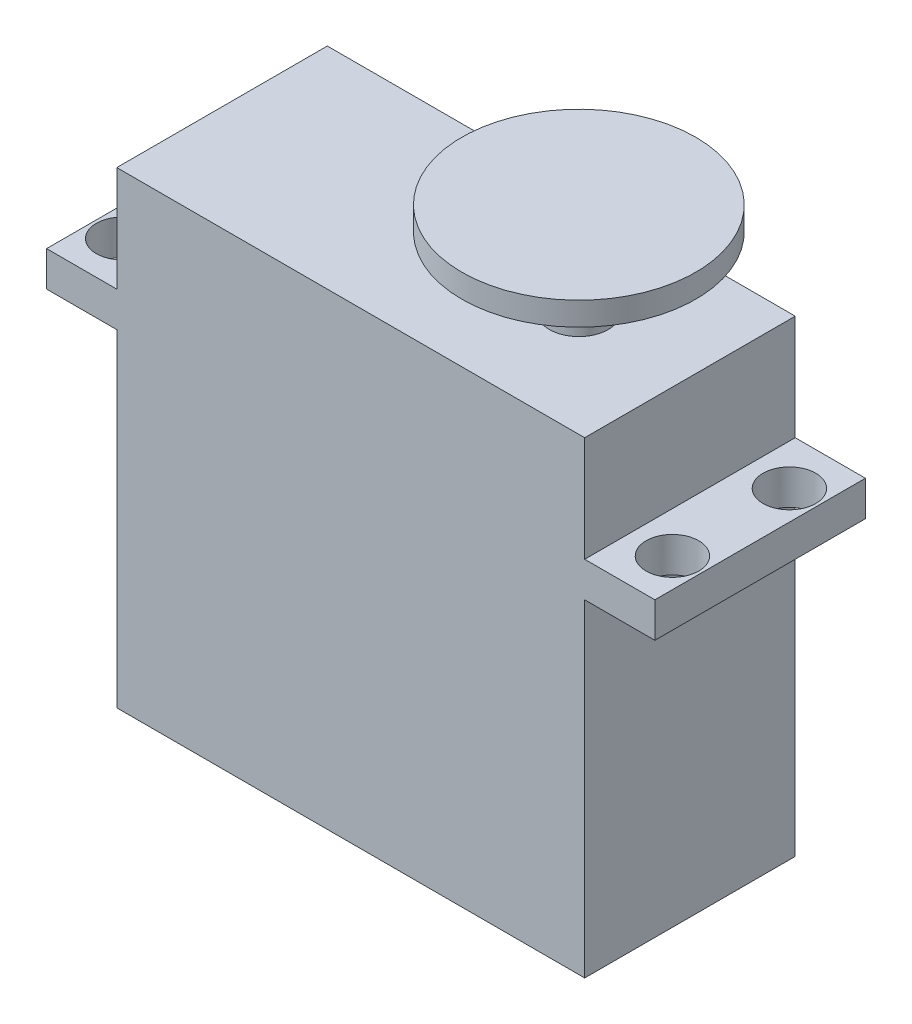
ISO-10303-21;
HEADER;
FILE_DESCRIPTION(('STEP AP214'),'2;1');
FILE_NAME('part.step','',(''),(''),'','','');
FILE_SCHEMA(('AUTOMOTIVE_DESIGN { 1 0 10303 214 1 1 1 1 }'));
ENDSEC;
DATA;
#1=APPLICATION_CONTEXT('core data for automotive mechanical design processes');
#2=APPLICATION_PROTOCOL_DEFINITION('international standard','automotive_design',2000,#1);
#3=PRODUCT_CONTEXT('',#1,'mechanical');
#4=PRODUCT('Part','Part','',(#3));
#5=PRODUCT_RELATED_PRODUCT_CATEGORY('part','',(#4));
#6=PRODUCT_DEFINITION_FORMATION('','',#4);
#7=PRODUCT_DEFINITION_CONTEXT('part definition',#1,'design');
#8=PRODUCT_DEFINITION('design','',#6,#7);
#9=PRODUCT_DEFINITION_SHAPE('','',#8);
#10=(LENGTH_UNIT() NAMED_UNIT(*) SI_UNIT(.MILLI.,.METRE.));
#11=(NAMED_UNIT(*) PLANE_ANGLE_UNIT() SI_UNIT($,.RADIAN.));
#12=(NAMED_UNIT(*) SI_UNIT($,.STERADIAN.) SOLID_ANGLE_UNIT());
#13=UNCERTAINTY_MEASURE_WITH_UNIT(LENGTH_MEASURE(1.E-05),#10,'distance_accuracy_value','');
#14=(GEOMETRIC_REPRESENTATION_CONTEXT(3) GLOBAL_UNCERTAINTY_ASSIGNED_CONTEXT((#13)) GLOBAL_UNIT_ASSIGNED_CONTEXT((#10,
#11,#12)) REPRESENTATION_CONTEXT('',''));
#15=CARTESIAN_POINT('',(0.,0.,0.));
#16=DIRECTION('',(0.,0.,1.));
#17=DIRECTION('',(1.,0.,0.));
#18=AXIS2_PLACEMENT_3D('',#15,#16,#17);
#19=CARTESIAN_POINT('',(40.,40.,0.));
#20=DIRECTION('',(-1.,0.,0.));
#21=DIRECTION('',(0.,0.,1.));
#22=AXIS2_PLACEMENT_3D('',#19,#20,#21);
#23=PLANE('',#22);
#24=DIRECTION('',(0.,0.,-1.));
#25=VECTOR('',#24,1.);
#26=CARTESIAN_POINT('',(40.,28.,0.));
#27=LINE('',#26,#25);
#28=CARTESIAN_POINT('',(40.,28.,0.));
#29=VERTEX_POINT('',#28);
#30=CARTESIAN_POINT('',(40.,28.,-18.));
#31=VERTEX_POINT('',#30);
#32=EDGE_CURVE('E148',#29,#31,#27,.T.);
#33=ORIENTED_EDGE('',*,*,#32,.F.);
#34=DIRECTION('',(0.,-1.,0.));
#35=VECTOR('',#34,1.);
#36=CARTESIAN_POINT('',(40.,40.,0.));
#37=LINE('',#36,#35);
#38=CARTESIAN_POINT('',(40.,0.,0.));
#39=VERTEX_POINT('',#38);
#40=EDGE_CURVE('E211',#29,#39,#37,.T.);
#41=ORIENTED_EDGE('',*,*,#40,.T.);
#42=DIRECTION('',(0.,0.,-1.));
#43=VECTOR('',#42,1.);
#44=CARTESIAN_POINT('',(40.,0.,0.));
#45=LINE('',#44,#43);
#46=CARTESIAN_POINT('',(40.,0.,-18.));
#47=VERTEX_POINT('',#46);
#48=EDGE_CURVE('E199',#39,#47,#45,.T.);
#49=ORIENTED_EDGE('',*,*,#48,.T.);
#50=DIRECTION('',(0.,-1.,0.));
#51=VECTOR('',#50,1.);
#52=CARTESIAN_POINT('',(40.,40.,-18.));
#53=LINE('',#52,#51);
#54=EDGE_CURVE('E207',#31,#47,#53,.T.);
#55=ORIENTED_EDGE('',*,*,#54,.F.);
#56=EDGE_LOOP('',(#33,#41,#49,#55));
#57=FACE_BOUND('',#56,.T.);
#58=ADVANCED_FACE('F34',(#57),#23,.F.);
#59=CARTESIAN_POINT('',(0.,40.,0.));
#60=DIRECTION('',(1.,0.,0.));
#61=DIRECTION('',(0.,0.,-1.));
#62=AXIS2_PLACEMENT_3D('',#59,#60,#61);
#63=PLANE('',#62);
#64=DIRECTION('',(0.,0.,1.));
#65=VECTOR('',#64,1.);
#66=CARTESIAN_POINT('',(0.,28.,0.));
#67=LINE('',#66,#65);
#68=CARTESIAN_POINT('',(0.,28.,-18.));
#69=VERTEX_POINT('',#68);
#70=CARTESIAN_POINT('',(0.,28.,0.));
#71=VERTEX_POINT('',#70);
#72=EDGE_CURVE('E175',#69,#71,#67,.T.);
#73=ORIENTED_EDGE('',*,*,#72,.F.);
#74=DIRECTION('',(0.,-1.,0.));
#75=VECTOR('',#74,1.);
#76=CARTESIAN_POINT('',(0.,40.,-18.));
#77=LINE('',#76,#75);
#78=CARTESIAN_POINT('',(0.,0.,-18.));
#79=VERTEX_POINT('',#78);
#80=EDGE_CURVE('E194',#69,#79,#77,.T.);
#81=ORIENTED_EDGE('',*,*,#80,.T.);
#82=DIRECTION('',(0.,0.,1.));
#83=VECTOR('',#82,1.);
#84=CARTESIAN_POINT('',(0.,0.,0.));
#85=LINE('',#84,#83);
#86=CARTESIAN_POINT('',(0.,0.,0.));
#87=VERTEX_POINT('',#86);
#88=EDGE_CURVE('E181',#79,#87,#85,.T.);
#89=ORIENTED_EDGE('',*,*,#88,.T.);
#90=DIRECTION('',(0.,-1.,0.));
#91=VECTOR('',#90,1.);
#92=CARTESIAN_POINT('',(0.,40.,0.));
#93=LINE('',#92,#91);
#94=EDGE_CURVE('E213',#71,#87,#93,.T.);
#95=ORIENTED_EDGE('',*,*,#94,.F.);
#96=EDGE_LOOP('',(#73,#81,#89,#95));
#97=FACE_BOUND('',#96,.T.);
#98=ADVANCED_FACE('F226',(#97),#63,.F.);
#99=CARTESIAN_POINT('',(0.,40.,-18.));
#100=VERTEX_POINT('',#99);
#101=CARTESIAN_POINT('',(0.,31.,-18.));
#102=VERTEX_POINT('',#101);
#103=EDGE_CURVE('E204',#100,#102,#77,.T.);
#104=ORIENTED_EDGE('',*,*,#103,.T.);
#105=DIRECTION('',(0.,0.,1.));
#106=VECTOR('',#105,1.);
#107=CARTESIAN_POINT('',(0.,31.,0.));
#108=LINE('',#107,#106);
#109=CARTESIAN_POINT('',(0.,31.,0.));
#110=VERTEX_POINT('',#109);
#111=EDGE_CURVE('E167',#102,#110,#108,.T.);
#112=ORIENTED_EDGE('',*,*,#111,.T.);
#113=CARTESIAN_POINT('',(0.,40.,0.));
#114=VERTEX_POINT('',#113);
#115=EDGE_CURVE('E42',#114,#110,#93,.T.);
#116=ORIENTED_EDGE('',*,*,#115,.F.);
#117=DIRECTION('',(0.,0.,1.));
#118=VECTOR('',#117,1.);
#119=CARTESIAN_POINT('',(0.,40.,0.));
#120=LINE('',#119,#118);
#121=EDGE_CURVE('E184',#100,#114,#120,.T.);
#122=ORIENTED_EDGE('',*,*,#121,.F.);
#123=EDGE_LOOP('',(#104,#112,#116,#122));
#124=FACE_BOUND('',#123,.T.);
#125=ADVANCED_FACE('F36',(#124),#63,.F.);
#126=CARTESIAN_POINT('',(0.,40.,0.));
#127=DIRECTION('',(0.,0.,-1.));
#128=DIRECTION('',(-1.,0.,0.));
#129=AXIS2_PLACEMENT_3D('',#126,#127,#128);
#130=PLANE('',#129);
#131=DIRECTION('',(1.,0.,0.));
#132=VECTOR('',#131,1.);
#133=CARTESIAN_POINT('',(0.,0.,0.));
#134=LINE('',#133,#132);
#135=EDGE_CURVE('E197',#87,#39,#134,.T.);
#136=ORIENTED_EDGE('',*,*,#135,.T.);
#137=ORIENTED_EDGE('',*,*,#40,.F.);
#138=DIRECTION('',(1.,0.,0.));
#139=VECTOR('',#138,1.);
#140=CARTESIAN_POINT('',(0.,28.,0.));
#141=LINE('',#140,#139);
#142=CARTESIAN_POINT('',(46.,28.,0.));
#143=VERTEX_POINT('',#142);
#144=EDGE_CURVE('E138',#29,#143,#141,.T.);
#145=ORIENTED_EDGE('',*,*,#144,.T.);
#146=DIRECTION('',(0.,-1.,0.));
#147=VECTOR('',#146,1.);
#148=CARTESIAN_POINT('',(46.,31.,0.));
#149=LINE('',#148,#147);
#150=CARTESIAN_POINT('',(46.,31.,0.));
#151=VERTEX_POINT('',#150);
#152=EDGE_CURVE('E134',#151,#143,#149,.T.);
#153=ORIENTED_EDGE('',*,*,#152,.F.);
#154=DIRECTION('',(1.,0.,0.));
#155=VECTOR('',#154,1.);
#156=CARTESIAN_POINT('',(0.,31.,0.));
#157=LINE('',#156,#155);
#158=CARTESIAN_POINT('',(40.,31.,0.));
#159=VERTEX_POINT('',#158);
#160=EDGE_CURVE('E122',#159,#151,#157,.T.);
#161=ORIENTED_EDGE('',*,*,#160,.F.);
#162=CARTESIAN_POINT('',(40.,40.,0.));
#163=VERTEX_POINT('',#162);
#164=EDGE_CURVE('E212',#163,#159,#37,.T.);
#165=ORIENTED_EDGE('',*,*,#164,.F.);
#166=DIRECTION('',(1.,0.,0.));
#167=VECTOR('',#166,1.);
#168=CARTESIAN_POINT('',(0.,40.,0.));
#169=LINE('',#168,#167);
#170=EDGE_CURVE('E187',#114,#163,#169,.T.);
#171=ORIENTED_EDGE('',*,*,#170,.F.);
#172=ORIENTED_EDGE('',*,*,#115,.T.);
#173=DIRECTION('',(-1.,0.,0.));
#174=VECTOR('',#173,1.);
#175=CARTESIAN_POINT('',(0.,31.,0.));
#176=LINE('',#175,#174);
#177=CARTESIAN_POINT('',(-6.,31.,0.));
#178=VERTEX_POINT('',#177);
#179=EDGE_CURVE('E57',#110,#178,#176,.T.);
#180=ORIENTED_EDGE('',*,*,#179,.T.);
#181=DIRECTION('',(0.,-1.,0.));
#182=VECTOR('',#181,1.);
#183=CARTESIAN_POINT('',(-6.,31.,0.));
#184=LINE('',#183,#182);
#185=CARTESIAN_POINT('',(-6.,28.,0.));
#186=VERTEX_POINT('',#185);
#187=EDGE_CURVE('E179',#178,#186,#184,.T.);
#188=ORIENTED_EDGE('',*,*,#187,.T.);
#189=DIRECTION('',(-1.,0.,0.));
#190=VECTOR('',#189,1.);
#191=CARTESIAN_POINT('',(0.,28.,0.));
#192=LINE('',#191,#190);
#193=EDGE_CURVE('E165',#71,#186,#192,.T.);
#194=ORIENTED_EDGE('',*,*,#193,.F.);
#195=ORIENTED_EDGE('',*,*,#94,.T.);
#196=EDGE_LOOP('',(#136,#137,#145,#153,#161,#165,#171,#172,#180,#188,#194,#195));
#197=FACE_BOUND('',#196,.T.);
#198=ADVANCED_FACE('F136',(#197),#130,.F.);
#199=ORIENTED_EDGE('',*,*,#164,.T.);
#200=DIRECTION('',(0.,0.,-1.));
#201=VECTOR('',#200,1.);
#202=CARTESIAN_POINT('',(40.,31.,0.));
#203=LINE('',#202,#201);
#204=CARTESIAN_POINT('',(40.,31.,-18.));
#205=VERTEX_POINT('',#204);
#206=EDGE_CURVE('E128',#159,#205,#203,.T.);
#207=ORIENTED_EDGE('',*,*,#206,.T.);
#208=CARTESIAN_POINT('',(40.,40.,-18.));
#209=VERTEX_POINT('',#208);
#210=EDGE_CURVE('E208',#209,#205,#53,.T.);
#211=ORIENTED_EDGE('',*,*,#210,.F.);
#212=DIRECTION('',(0.,0.,-1.));
#213=VECTOR('',#212,1.);
#214=CARTESIAN_POINT('',(40.,40.,0.));
#215=LINE('',#214,#213);
#216=EDGE_CURVE('E190',#163,#209,#215,.T.);
#217=ORIENTED_EDGE('',*,*,#216,.F.);
#218=EDGE_LOOP('',(#199,#207,#211,#217));
#219=FACE_BOUND('',#218,.T.);
#220=ADVANCED_FACE('F254',(#219),#23,.F.);
#221=CARTESIAN_POINT('',(0.,40.,-18.));
#222=DIRECTION('',(0.,0.,1.));
#223=DIRECTION('',(1.,0.,0.));
#224=AXIS2_PLACEMENT_3D('',#221,#222,#223);
#225=PLANE('',#224);
#226=DIRECTION('',(-1.,0.,0.));
#227=VECTOR('',#226,1.);
#228=CARTESIAN_POINT('',(0.,0.,-18.));
#229=LINE('',#228,#227);
#230=EDGE_CURVE('E188',#47,#79,#229,.T.);
#231=ORIENTED_EDGE('',*,*,#230,.T.);
#232=ORIENTED_EDGE('',*,*,#80,.F.);
#233=DIRECTION('',(-1.,0.,0.));
#234=VECTOR('',#233,1.);
#235=CARTESIAN_POINT('',(0.,28.,-18.));
#236=LINE('',#235,#234);
#237=CARTESIAN_POINT('',(-6.,28.,-18.));
#238=VERTEX_POINT('',#237);
#239=EDGE_CURVE('E173',#69,#238,#236,.T.);
#240=ORIENTED_EDGE('',*,*,#239,.T.);
#241=DIRECTION('',(0.,-1.,0.));
#242=VECTOR('',#241,1.);
#243=CARTESIAN_POINT('',(-6.,31.,-18.));
#244=LINE('',#243,#242);
#245=CARTESIAN_POINT('',(-6.,31.,-18.));
#246=VERTEX_POINT('',#245);
#247=EDGE_CURVE('E170',#246,#238,#244,.T.);
#248=ORIENTED_EDGE('',*,*,#247,.F.);
#249=DIRECTION('',(-1.,0.,0.));
#250=VECTOR('',#249,1.);
#251=CARTESIAN_POINT('',(0.,31.,-18.));
#252=LINE('',#251,#250);
#253=EDGE_CURVE('E164',#102,#246,#252,.T.);
#254=ORIENTED_EDGE('',*,*,#253,.F.);
#255=ORIENTED_EDGE('',*,*,#103,.F.);
#256=DIRECTION('',(-1.,0.,0.));
#257=VECTOR('',#256,1.);
#258=CARTESIAN_POINT('',(0.,40.,-18.));
#259=LINE('',#258,#257);
#260=EDGE_CURVE('E192',#209,#100,#259,.T.);
#261=ORIENTED_EDGE('',*,*,#260,.F.);
#262=ORIENTED_EDGE('',*,*,#210,.T.);
#263=DIRECTION('',(1.,0.,0.));
#264=VECTOR('',#263,1.);
#265=CARTESIAN_POINT('',(0.,31.,-18.));
#266=LINE('',#265,#264);
#267=CARTESIAN_POINT('',(46.,31.,-18.));
#268=VERTEX_POINT('',#267);
#269=EDGE_CURVE('E49',#205,#268,#266,.T.);
#270=ORIENTED_EDGE('',*,*,#269,.T.);
#271=DIRECTION('',(0.,-1.,0.));
#272=VECTOR('',#271,1.);
#273=CARTESIAN_POINT('',(46.,31.,-18.));
#274=LINE('',#273,#272);
#275=CARTESIAN_POINT('',(46.,28.,-18.));
#276=VERTEX_POINT('',#275);
#277=EDGE_CURVE('E142',#268,#276,#274,.T.);
#278=ORIENTED_EDGE('',*,*,#277,.T.);
#279=DIRECTION('',(1.,0.,0.));
#280=VECTOR('',#279,1.);
#281=CARTESIAN_POINT('',(0.,28.,-18.));
#282=LINE('',#281,#280);
#283=EDGE_CURVE('E145',#31,#276,#282,.T.);
#284=ORIENTED_EDGE('',*,*,#283,.F.);
#285=ORIENTED_EDGE('',*,*,#54,.T.);
#286=EDGE_LOOP('',(#231,#232,#240,#248,#254,#255,#261,#262,#270,#278,#284,#285));
#287=FACE_BOUND('',#286,.T.);
#288=ADVANCED_FACE('F229',(#287),#225,.F.);
#289=CARTESIAN_POINT('',(0.,40.,0.));
#290=DIRECTION('',(0.,-1.,0.));
#291=DIRECTION('',(0.,0.,-1.));
#292=AXIS2_PLACEMENT_3D('',#289,#290,#291);
#293=PLANE('',#292);
#294=CARTESIAN_POINT('',(30.5,40.,-9.));
#295=DIRECTION('',(0.,-1.,0.));
#296=DIRECTION('',(0.,0.,-1.));
#297=AXIS2_PLACEMENT_3D('',#294,#295,#296);
#298=CIRCLE('',#297,2.5);
#299=CARTESIAN_POINT('',(30.5,40.,-11.5));
#300=VERTEX_POINT('',#299);
#301=EDGE_CURVE('E11',#300,#300,#298,.F.);
#302=ORIENTED_EDGE('',*,*,#301,.F.);
#303=EDGE_LOOP('',(#302));
#304=FACE_BOUND('',#303,.T.);
#305=ORIENTED_EDGE('',*,*,#121,.T.);
#306=ORIENTED_EDGE('',*,*,#170,.T.);
#307=ORIENTED_EDGE('',*,*,#216,.T.);
#308=ORIENTED_EDGE('',*,*,#260,.T.);
#309=EDGE_LOOP('',(#305,#306,#307,#308));
#310=FACE_BOUND('',#309,.T.);
#311=ADVANCED_FACE('F265',(#304,#310),#293,.F.);
#312=CARTESIAN_POINT('',(0.,0.,0.));
#313=DIRECTION('',(0.,-1.,0.));
#314=DIRECTION('',(0.,0.,-1.));
#315=AXIS2_PLACEMENT_3D('',#312,#313,#314);
#316=PLANE('',#315);
#317=ORIENTED_EDGE('',*,*,#88,.F.);
#318=ORIENTED_EDGE('',*,*,#230,.F.);
#319=ORIENTED_EDGE('',*,*,#48,.F.);
#320=ORIENTED_EDGE('',*,*,#135,.F.);
#321=EDGE_LOOP('',(#317,#318,#319,#320));
#322=FACE_BOUND('',#321,.T.);
#323=ADVANCED_FACE('F224',(#322),#316,.T.);
#324=CARTESIAN_POINT('',(-6.,31.,0.));
#325=DIRECTION('',(1.,0.,0.));
#326=DIRECTION('',(0.,0.,-1.));
#327=AXIS2_PLACEMENT_3D('',#324,#325,#326);
#328=PLANE('',#327);
#329=DIRECTION('',(0.,0.,1.));
#330=VECTOR('',#329,1.);
#331=CARTESIAN_POINT('',(-6.,28.,0.));
#332=LINE('',#331,#330);
#333=EDGE_CURVE('E160',#238,#186,#332,.T.);
#334=ORIENTED_EDGE('',*,*,#333,.T.);
#335=ORIENTED_EDGE('',*,*,#187,.F.);
#336=DIRECTION('',(0.,0.,1.));
#337=VECTOR('',#336,1.);
#338=CARTESIAN_POINT('',(-6.,31.,0.));
#339=LINE('',#338,#337);
#340=EDGE_CURVE('E162',#246,#178,#339,.T.);
#341=ORIENTED_EDGE('',*,*,#340,.F.);
#342=ORIENTED_EDGE('',*,*,#247,.T.);
#343=EDGE_LOOP('',(#334,#335,#341,#342));
#344=FACE_BOUND('',#343,.T.);
#345=ADVANCED_FACE('F279',(#344),#328,.F.);
#346=CARTESIAN_POINT('',(0.,31.,0.));
#347=DIRECTION('',(0.,-1.,0.));
#348=DIRECTION('',(0.,0.,-1.));
#349=AXIS2_PLACEMENT_3D('',#346,#347,#348);
#350=PLANE('',#349);
#351=CARTESIAN_POINT('',(-3.5,31.,-14.));
#352=DIRECTION('',(0.,1.,0.));
#353=DIRECTION('',(0.,0.,1.));
#354=AXIS2_PLACEMENT_3D('',#351,#352,#353);
#355=CIRCLE('',#354,2.25);
#356=CARTESIAN_POINT('',(-3.5,31.,-11.75));
#357=VERTEX_POINT('',#356);
#358=EDGE_CURVE('E401',#357,#357,#355,.T.);
#359=ORIENTED_EDGE('',*,*,#358,.F.);
#360=EDGE_LOOP('',(#359));
#361=FACE_BOUND('',#360,.T.);
#362=CARTESIAN_POINT('',(-3.5,31.,-4.));
#363=DIRECTION('',(0.,1.,0.));
#364=DIRECTION('',(0.,0.,1.));
#365=AXIS2_PLACEMENT_3D('',#362,#363,#364);
#366=CIRCLE('',#365,2.25);
#367=CARTESIAN_POINT('',(-3.5,31.,-1.75));
#368=VERTEX_POINT('',#367);
#369=EDGE_CURVE('E410',#368,#368,#366,.T.);
#370=ORIENTED_EDGE('',*,*,#369,.F.);
#371=EDGE_LOOP('',(#370));
#372=FACE_BOUND('',#371,.T.);
#373=ORIENTED_EDGE('',*,*,#340,.T.);
#374=ORIENTED_EDGE('',*,*,#179,.F.);
#375=ORIENTED_EDGE('',*,*,#111,.F.);
#376=ORIENTED_EDGE('',*,*,#253,.T.);
#377=EDGE_LOOP('',(#373,#374,#375,#376));
#378=FACE_BOUND('',#377,.T.);
#379=ADVANCED_FACE('F273',(#361,#372,#378),#350,.F.);
#380=CARTESIAN_POINT('',(0.,28.,0.));
#381=DIRECTION('',(0.,-1.,0.));
#382=DIRECTION('',(0.,0.,-1.));
#383=AXIS2_PLACEMENT_3D('',#380,#381,#382);
#384=PLANE('',#383);
#385=CARTESIAN_POINT('',(-3.5,28.,-14.));
#386=DIRECTION('',(0.,-1.,0.));
#387=DIRECTION('',(0.,0.,-1.));
#388=AXIS2_PLACEMENT_3D('',#385,#386,#387);
#389=CIRCLE('',#388,2.25);
#390=CARTESIAN_POINT('',(-3.5,28.,-16.25));
#391=VERTEX_POINT('',#390);
#392=EDGE_CURVE('E404',#391,#391,#389,.F.);
#393=ORIENTED_EDGE('',*,*,#392,.T.);
#394=EDGE_LOOP('',(#393));
#395=FACE_BOUND('',#394,.T.);
#396=CARTESIAN_POINT('',(-3.5,28.,-4.));
#397=DIRECTION('',(0.,-1.,0.));
#398=DIRECTION('',(0.,0.,-1.));
#399=AXIS2_PLACEMENT_3D('',#396,#397,#398);
#400=CIRCLE('',#399,2.25);
#401=CARTESIAN_POINT('',(-3.5,28.,-6.25));
#402=VERTEX_POINT('',#401);
#403=EDGE_CURVE('E407',#402,#402,#400,.F.);
#404=ORIENTED_EDGE('',*,*,#403,.T.);
#405=EDGE_LOOP('',(#404));
#406=FACE_BOUND('',#405,.T.);
#407=ORIENTED_EDGE('',*,*,#333,.F.);
#408=ORIENTED_EDGE('',*,*,#239,.F.);
#409=ORIENTED_EDGE('',*,*,#72,.T.);
#410=ORIENTED_EDGE('',*,*,#193,.T.);
#411=EDGE_LOOP('',(#407,#408,#409,#410));
#412=FACE_BOUND('',#411,.T.);
#413=ADVANCED_FACE('F281',(#395,#406,#412),#384,.T.);
#414=CARTESIAN_POINT('',(46.,31.,0.));
#415=DIRECTION('',(-1.,0.,0.));
#416=DIRECTION('',(0.,0.,1.));
#417=AXIS2_PLACEMENT_3D('',#414,#415,#416);
#418=PLANE('',#417);
#419=DIRECTION('',(0.,0.,-1.));
#420=VECTOR('',#419,1.);
#421=CARTESIAN_POINT('',(46.,28.,0.));
#422=LINE('',#421,#420);
#423=EDGE_CURVE('E156',#143,#276,#422,.T.);
#424=ORIENTED_EDGE('',*,*,#423,.T.);
#425=ORIENTED_EDGE('',*,*,#277,.F.);
#426=DIRECTION('',(0.,0.,-1.));
#427=VECTOR('',#426,1.);
#428=CARTESIAN_POINT('',(46.,31.,0.));
#429=LINE('',#428,#427);
#430=EDGE_CURVE('E126',#151,#268,#429,.T.);
#431=ORIENTED_EDGE('',*,*,#430,.F.);
#432=ORIENTED_EDGE('',*,*,#152,.T.);
#433=EDGE_LOOP('',(#424,#425,#431,#432));
#434=FACE_BOUND('',#433,.T.);
#435=ADVANCED_FACE('F144',(#434),#418,.F.);
#436=CARTESIAN_POINT('',(0.,31.,0.));
#437=DIRECTION('',(0.,-1.,0.));
#438=DIRECTION('',(0.,0.,-1.));
#439=AXIS2_PLACEMENT_3D('',#436,#437,#438);
#440=PLANE('',#439);
#441=CARTESIAN_POINT('',(43.5,31.,-14.));
#442=DIRECTION('',(0.,-1.,0.));
#443=DIRECTION('',(0.,0.,1.));
#444=AXIS2_PLACEMENT_3D('',#441,#442,#443);
#445=CIRCLE('',#444,2.25);
#446=CARTESIAN_POINT('',(43.5,31.,-11.75));
#447=VERTEX_POINT('',#446);
#448=EDGE_CURVE('E418',#447,#447,#445,.T.);
#449=ORIENTED_EDGE('',*,*,#448,.T.);
#450=EDGE_LOOP('',(#449));
#451=FACE_BOUND('',#450,.T.);
#452=CARTESIAN_POINT('',(43.5,31.,-4.));
#453=DIRECTION('',(0.,-1.,0.));
#454=DIRECTION('',(0.,0.,1.));
#455=AXIS2_PLACEMENT_3D('',#452,#453,#454);
#456=CIRCLE('',#455,2.25);
#457=CARTESIAN_POINT('',(43.5,31.,-1.75));
#458=VERTEX_POINT('',#457);
#459=EDGE_CURVE('E419',#458,#458,#456,.T.);
#460=ORIENTED_EDGE('',*,*,#459,.T.);
#461=EDGE_LOOP('',(#460));
#462=FACE_BOUND('',#461,.T.);
#463=ORIENTED_EDGE('',*,*,#430,.T.);
#464=ORIENTED_EDGE('',*,*,#269,.F.);
#465=ORIENTED_EDGE('',*,*,#206,.F.);
#466=ORIENTED_EDGE('',*,*,#160,.T.);
#467=EDGE_LOOP('',(#463,#464,#465,#466));
#468=FACE_BOUND('',#467,.T.);
#469=ADVANCED_FACE('F124',(#451,#462,#468),#440,.F.);
#470=CARTESIAN_POINT('',(0.,28.,0.));
#471=DIRECTION('',(0.,-1.,0.));
#472=DIRECTION('',(0.,0.,-1.));
#473=AXIS2_PLACEMENT_3D('',#470,#471,#472);
#474=PLANE('',#473);
#475=CARTESIAN_POINT('',(43.5,28.,-14.));
#476=DIRECTION('',(0.,-1.,0.));
#477=DIRECTION('',(0.,0.,-1.));
#478=AXIS2_PLACEMENT_3D('',#475,#476,#477);
#479=CIRCLE('',#478,2.25);
#480=CARTESIAN_POINT('',(43.5,28.,-16.25));
#481=VERTEX_POINT('',#480);
#482=EDGE_CURVE('E411',#481,#481,#479,.T.);
#483=ORIENTED_EDGE('',*,*,#482,.F.);
#484=EDGE_LOOP('',(#483));
#485=FACE_BOUND('',#484,.T.);
#486=CARTESIAN_POINT('',(43.5,28.,-4.));
#487=DIRECTION('',(0.,-1.,0.));
#488=DIRECTION('',(0.,0.,-1.));
#489=AXIS2_PLACEMENT_3D('',#486,#487,#488);
#490=CIRCLE('',#489,2.25);
#491=CARTESIAN_POINT('',(43.5,28.,-6.25));
#492=VERTEX_POINT('',#491);
#493=EDGE_CURVE('E415',#492,#492,#490,.T.);
#494=ORIENTED_EDGE('',*,*,#493,.F.);
#495=EDGE_LOOP('',(#494));
#496=FACE_BOUND('',#495,.T.);
#497=ORIENTED_EDGE('',*,*,#423,.F.);
#498=ORIENTED_EDGE('',*,*,#144,.F.);
#499=ORIENTED_EDGE('',*,*,#32,.T.);
#500=ORIENTED_EDGE('',*,*,#283,.T.);
#501=EDGE_LOOP('',(#497,#498,#499,#500));
#502=FACE_BOUND('',#501,.T.);
#503=ADVANCED_FACE('F235',(#485,#496,#502),#474,.T.);
#504=CARTESIAN_POINT('',(30.5,46.,-9.));
#505=DIRECTION('',(0.,-1.,0.));
#506=DIRECTION('',(0.,0.,-1.));
#507=AXIS2_PLACEMENT_3D('',#504,#505,#506);
#508=CYLINDRICAL_SURFACE('',#507,2.5);
#509=CARTESIAN_POINT('',(30.5,46.,-9.));
#510=DIRECTION('',(0.,1.,0.));
#511=DIRECTION('',(0.,0.,1.));
#512=AXIS2_PLACEMENT_3D('',#509,#510,#511);
#513=CIRCLE('',#512,2.5);
#514=CARTESIAN_POINT('',(30.5,46.,-6.5));
#515=VERTEX_POINT('',#514);
#516=EDGE_CURVE('E151',#515,#515,#513,.T.);
#517=ORIENTED_EDGE('',*,*,#516,.F.);
#518=EDGE_LOOP('',(#517));
#519=FACE_BOUND('',#518,.T.);
#520=ORIENTED_EDGE('',*,*,#301,.T.);
#521=EDGE_LOOP('',(#520));
#522=FACE_BOUND('',#521,.T.);
#523=ADVANCED_FACE('F237',(#519,#522),#508,.T.);
#524=CARTESIAN_POINT('',(30.5,48.,-9.));
#525=DIRECTION('',(0.,-1.,0.));
#526=DIRECTION('',(0.,0.,-1.));
#527=AXIS2_PLACEMENT_3D('',#524,#525,#526);
#528=CYLINDRICAL_SURFACE('',#527,10.);
#529=CARTESIAN_POINT('',(30.5,48.,-9.));
#530=DIRECTION('',(0.,1.,0.));
#531=DIRECTION('',(0.,0.,1.));
#532=AXIS2_PLACEMENT_3D('',#529,#530,#531);
#533=CIRCLE('',#532,10.);
#534=CARTESIAN_POINT('',(30.5,48.,1.));
#535=VERTEX_POINT('',#534);
#536=EDGE_CURVE('E396',#535,#535,#533,.T.);
#537=ORIENTED_EDGE('',*,*,#536,.F.);
#538=EDGE_LOOP('',(#537));
#539=FACE_BOUND('',#538,.T.);
#540=CARTESIAN_POINT('',(30.5,46.,-9.));
#541=DIRECTION('',(0.,1.,0.));
#542=DIRECTION('',(0.,0.,1.));
#543=AXIS2_PLACEMENT_3D('',#540,#541,#542);
#544=CIRCLE('',#543,10.);
#545=CARTESIAN_POINT('',(30.5,46.,1.));
#546=VERTEX_POINT('',#545);
#547=EDGE_CURVE('E399',#546,#546,#544,.T.);
#548=ORIENTED_EDGE('',*,*,#547,.T.);
#549=EDGE_LOOP('',(#548));
#550=FACE_BOUND('',#549,.T.);
#551=ADVANCED_FACE('F244',(#539,#550),#528,.T.);
#552=CARTESIAN_POINT('',(30.5,48.,-9.));
#553=DIRECTION('',(0.,1.,0.));
#554=DIRECTION('',(0.,0.,1.));
#555=AXIS2_PLACEMENT_3D('',#552,#553,#554);
#556=PLANE('',#555);
#557=ORIENTED_EDGE('',*,*,#536,.T.);
#558=EDGE_LOOP('',(#557));
#559=FACE_BOUND('',#558,.T.);
#560=ADVANCED_FACE('F383',(#559),#556,.T.);
#561=CARTESIAN_POINT('',(30.5,46.,-9.));
#562=DIRECTION('',(0.,1.,0.));
#563=DIRECTION('',(0.,0.,1.));
#564=AXIS2_PLACEMENT_3D('',#561,#562,#563);
#565=PLANE('',#564);
#566=ORIENTED_EDGE('',*,*,#516,.T.);
#567=EDGE_LOOP('',(#566));
#568=FACE_BOUND('',#567,.T.);
#569=ORIENTED_EDGE('',*,*,#547,.F.);
#570=EDGE_LOOP('',(#569));
#571=FACE_BOUND('',#570,.T.);
#572=ADVANCED_FACE('F320',(#568,#571),#565,.F.);
#573=CARTESIAN_POINT('',(-3.5,-0.001000000000001,-4.));
#574=DIRECTION('',(0.,1.,0.));
#575=DIRECTION('',(0.,0.,1.));
#576=AXIS2_PLACEMENT_3D('',#573,#574,#575);
#577=CYLINDRICAL_SURFACE('',#576,2.25);
#578=ORIENTED_EDGE('',*,*,#403,.F.);
#579=EDGE_LOOP('',(#578));
#580=FACE_BOUND('',#579,.T.);
#581=ORIENTED_EDGE('',*,*,#369,.T.);
#582=EDGE_LOOP('',(#581));
#583=FACE_BOUND('',#582,.T.);
#584=ADVANCED_FACE('F330',(#580,#583),#577,.F.);
#585=CARTESIAN_POINT('',(-3.5,-0.001000000000001,-14.));
#586=DIRECTION('',(0.,1.,0.));
#587=DIRECTION('',(0.,0.,1.));
#588=AXIS2_PLACEMENT_3D('',#585,#586,#587);
#589=CYLINDRICAL_SURFACE('',#588,2.25);
#590=ORIENTED_EDGE('',*,*,#392,.F.);
#591=EDGE_LOOP('',(#590));
#592=FACE_BOUND('',#591,.T.);
#593=ORIENTED_EDGE('',*,*,#358,.T.);
#594=EDGE_LOOP('',(#593));
#595=FACE_BOUND('',#594,.T.);
#596=ADVANCED_FACE('F335',(#592,#595),#589,.F.);
#597=CARTESIAN_POINT('',(43.5,-0.001000000000001,-4.));
#598=DIRECTION('',(0.,1.,0.));
#599=DIRECTION('',(0.,0.,1.));
#600=AXIS2_PLACEMENT_3D('',#597,#598,#599);
#601=CYLINDRICAL_SURFACE('',#600,2.25);
#602=ORIENTED_EDGE('',*,*,#493,.T.);
#603=EDGE_LOOP('',(#602));
#604=FACE_BOUND('',#603,.T.);
#605=ORIENTED_EDGE('',*,*,#459,.F.);
#606=EDGE_LOOP('',(#605));
#607=FACE_BOUND('',#606,.T.);
#608=ADVANCED_FACE('F345',(#604,#607),#601,.F.);
#609=CARTESIAN_POINT('',(43.5,-0.001000000000001,-14.));
#610=DIRECTION('',(0.,1.,0.));
#611=DIRECTION('',(0.,0.,1.));
#612=AXIS2_PLACEMENT_3D('',#609,#610,#611);
#613=CYLINDRICAL_SURFACE('',#612,2.25);
#614=ORIENTED_EDGE('',*,*,#482,.T.);
#615=EDGE_LOOP('',(#614));
#616=FACE_BOUND('',#615,.T.);
#617=ORIENTED_EDGE('',*,*,#448,.F.);
#618=EDGE_LOOP('',(#617));
#619=FACE_BOUND('',#618,.T.);
#620=ADVANCED_FACE('F366',(#616,#619),#613,.F.);
#621=CLOSED_SHELL('',(#58,#98,#125,#198,#220,#288,#311,#323,#345,#379,#413,#435,#469,#503,#523,
#551,#560,#572,#584,#596,#608,#620));
#622=MANIFOLD_SOLID_BREP('B2',#621);
#623=ADVANCED_BREP_SHAPE_REPRESENTATION('',(#18,#622),#14);
#624=SHAPE_DEFINITION_REPRESENTATION(#9,#623);
ENDSEC;
END-ISO-10303-21;
